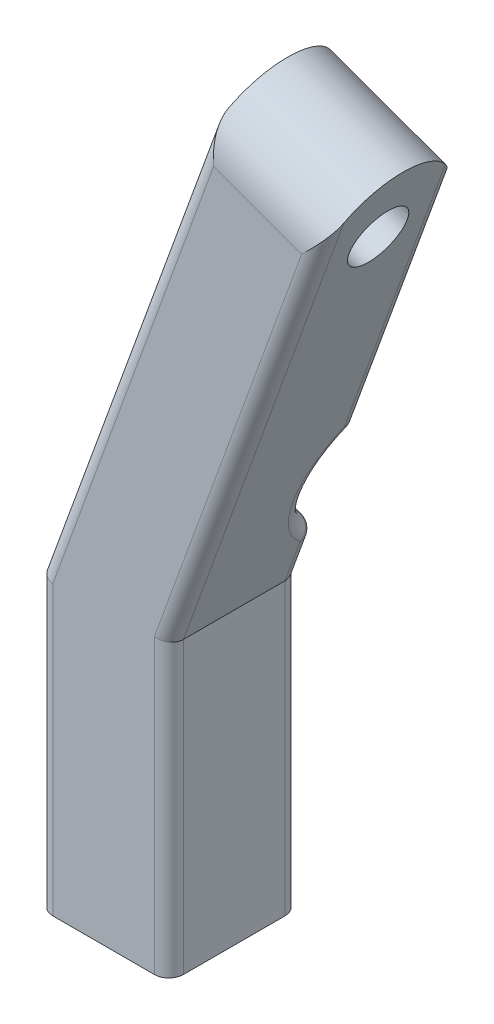
ISO-10303-21;
HEADER;
FILE_DESCRIPTION(('STEP AP214'),'2;1');
FILE_NAME('part.step','',(''),(''),'','','');
FILE_SCHEMA(('AUTOMOTIVE_DESIGN { 1 0 10303 214 1 1 1 1 }'));
ENDSEC;
DATA;
#1=APPLICATION_CONTEXT('core data for automotive mechanical design processes');
#2=APPLICATION_PROTOCOL_DEFINITION('international standard','automotive_design',2000,#1);
#3=PRODUCT_CONTEXT('',#1,'mechanical');
#4=PRODUCT('Part','Part','',(#3));
#5=PRODUCT_RELATED_PRODUCT_CATEGORY('part','',(#4));
#6=PRODUCT_DEFINITION_FORMATION('','',#4);
#7=PRODUCT_DEFINITION_CONTEXT('part definition',#1,'design');
#8=PRODUCT_DEFINITION('design','',#6,#7);
#9=PRODUCT_DEFINITION_SHAPE('','',#8);
#10=(LENGTH_UNIT() NAMED_UNIT(*) SI_UNIT(.MILLI.,.METRE.));
#11=(NAMED_UNIT(*) PLANE_ANGLE_UNIT() SI_UNIT($,.RADIAN.));
#12=(NAMED_UNIT(*) SI_UNIT($,.STERADIAN.) SOLID_ANGLE_UNIT());
#13=UNCERTAINTY_MEASURE_WITH_UNIT(LENGTH_MEASURE(1.E-05),#10,'distance_accuracy_value','');
#14=(GEOMETRIC_REPRESENTATION_CONTEXT(3) GLOBAL_UNCERTAINTY_ASSIGNED_CONTEXT((#13)) GLOBAL_UNIT_ASSIGNED_CONTEXT((#10,
#11,#12)) REPRESENTATION_CONTEXT('',''));
#15=CARTESIAN_POINT('',(0.,0.,0.));
#16=DIRECTION('',(0.,0.,1.));
#17=DIRECTION('',(1.,0.,0.));
#18=AXIS2_PLACEMENT_3D('',#15,#16,#17);
#19=CARTESIAN_POINT('',(20.6286848730728,51.9495491067209,9.));
#20=DIRECTION('',(-0.939692620785908,0.34202014332567,0.));
#21=DIRECTION('',(-0.34202014332567,-0.939692620785908,0.));
#22=AXIS2_PLACEMENT_3D('',#19,#20,#21);
#23=PLANE('',#22);
#24=CARTESIAN_POINT('',(18.9185841564444,47.2510860027914,4.5));
#25=DIRECTION('',(-0.939692620785908,0.34202014332567,0.));
#26=DIRECTION('',(-0.34202014332567,-0.939692620785908,0.));
#27=AXIS2_PLACEMENT_3D('',#24,#25,#26);
#28=CIRCLE('',#27,2.);
#29=CARTESIAN_POINT('',(18.2345438697931,45.3717007612196,4.5));
#30=VERTEX_POINT('',#29);
#31=EDGE_CURVE('E405',#30,#30,#28,.T.);
#32=ORIENTED_EDGE('',*,*,#31,.T.);
#33=EDGE_LOOP('',(#32));
#34=FACE_BOUND('',#33,.T.);
#35=DIRECTION('',(0.34202014332567,0.939692620785908,0.));
#36=VECTOR('',#35,1.);
#37=CARTESIAN_POINT('',(20.6286848730728,51.9495491067209,0.999999999999999));
#38=LINE('',#37,#36);
#39=CARTESIAN_POINT('',(13.0947116552434,31.2501278119588,0.999999999999998));
#40=VERTEX_POINT('',#39);
#41=CARTESIAN_POINT('',(20.0569732786992,50.378784410739,0.999999999999999));
#42=VERTEX_POINT('',#41);
#43=EDGE_CURVE('E198',#40,#42,#38,.T.);
#44=ORIENTED_EDGE('',*,*,#43,.T.);
#45=CARTESIAN_POINT('',(19.0895942281073,47.7209323131843,4.5));
#46=DIRECTION('',(0.939692620785908,-0.34202014332567,0.));
#47=DIRECTION('',(0.34202014332567,0.939692620785908,0.));
#48=AXIS2_PLACEMENT_3D('',#45,#46,#47);
#49=CIRCLE('',#48,4.5);
#50=CARTESIAN_POINT('',(20.0569732786992,50.378784410739,8.));
#51=VERTEX_POINT('',#50);
#52=EDGE_CURVE('E181',#42,#51,#49,.T.);
#53=ORIENTED_EDGE('',*,*,#52,.T.);
#54=DIRECTION('',(0.34202014332567,0.939692620785908,0.));
#55=VECTOR('',#54,1.);
#56=CARTESIAN_POINT('',(20.6286848730728,51.9495491067209,8.));
#57=LINE('',#56,#55);
#58=CARTESIAN_POINT('',(9.,20.,8.));
#59=VERTEX_POINT('',#58);
#60=EDGE_CURVE('E299',#51,#59,#57,.F.);
#61=ORIENTED_EDGE('',*,*,#60,.T.);
#62=DIRECTION('',(0.,0.,-1.));
#63=VECTOR('',#62,1.);
#64=CARTESIAN_POINT('',(9.,20.,9.));
#65=LINE('',#64,#63);
#66=CARTESIAN_POINT('',(9.,20.,0.999999999999999));
#67=VERTEX_POINT('',#66);
#68=EDGE_CURVE('E350',#59,#67,#65,.T.);
#69=ORIENTED_EDGE('',*,*,#68,.T.);
#70=DIRECTION('',(0.34202014332567,0.939692620785908,0.));
#71=VECTOR('',#70,1.);
#72=CARTESIAN_POINT('',(10.0355904946417,22.8452614998299,0.999999999999999));
#73=LINE('',#72,#71);
#74=CARTESIAN_POINT('',(10.0355904946417,22.8452614998299,0.999999999999999));
#75=VERTEX_POINT('',#74);
#76=EDGE_CURVE('E209',#67,#75,#73,.T.);
#77=ORIENTED_EDGE('',*,*,#76,.T.);
#78=CARTESIAN_POINT('',(11.5651510749425,27.0476946558943,-3.));
#79=DIRECTION('',(-0.939692620785908,0.34202014332567,0.));
#80=DIRECTION('',(-0.34202014332567,-0.939692620785908,0.));
#81=AXIS2_PLACEMENT_3D('',#78,#79,#80);
#82=CIRCLE('',#81,6.);
#83=EDGE_CURVE('E203',#75,#40,#82,.T.);
#84=ORIENTED_EDGE('',*,*,#83,.T.);
#85=EDGE_LOOP('',(#44,#53,#61,#69,#77,#84));
#86=FACE_BOUND('',#85,.T.);
#87=ADVANCED_FACE('F52',(#34,#86),#23,.F.);
#88=CARTESIAN_POINT('',(0.,20.,9.));
#89=DIRECTION('',(0.939692620785908,-0.342020143325669,0.));
#90=DIRECTION('',(0.342020143325669,0.939692620785908,0.));
#91=AXIS2_PLACEMENT_3D('',#88,#89,#90);
#92=PLANE('',#91);
#93=CARTESIAN_POINT('',(10.971384162409,50.1436302463808,4.5));
#94=DIRECTION('',(-0.939692620785908,0.342020143325669,0.));
#95=DIRECTION('',(-0.342020143325669,-0.939692620785908,0.));
#96=AXIS2_PLACEMENT_3D('',#93,#94,#95);
#97=CIRCLE('',#96,2.);
#98=CARTESIAN_POINT('',(10.2873438757577,48.264245004809,4.5));
#99=VERTEX_POINT('',#98);
#100=EDGE_CURVE('E408',#99,#99,#97,.T.);
#101=ORIENTED_EDGE('',*,*,#100,.F.);
#102=EDGE_LOOP('',(#101));
#103=FACE_BOUND('',#102,.T.);
#104=CARTESIAN_POINT('',(11.1423942340719,50.6134765567737,4.5));
#105=DIRECTION('',(0.939692620785908,-0.342020143325669,0.));
#106=DIRECTION('',(0.342020143325669,0.939692620785908,0.));
#107=AXIS2_PLACEMENT_3D('',#104,#105,#106);
#108=CIRCLE('',#107,4.5);
#109=CARTESIAN_POINT('',(12.1097732846638,53.2713286543284,1.00000000000001));
#110=VERTEX_POINT('',#109);
#111=CARTESIAN_POINT('',(12.1097732846638,53.2713286543284,8.));
#112=VERTEX_POINT('',#111);
#113=EDGE_CURVE('E72',#110,#112,#108,.T.);
#114=ORIENTED_EDGE('',*,*,#113,.F.);
#115=DIRECTION('',(-0.342020143325669,-0.939692620785908,0.));
#116=VECTOR('',#115,1.);
#117=CARTESIAN_POINT('',(5.14751166120796,34.1426720555482,0.999999999999999));
#118=LINE('',#117,#116);
#119=CARTESIAN_POINT('',(5.14751166120796,34.1426720555482,0.999999999999999));
#120=VERTEX_POINT('',#119);
#121=EDGE_CURVE('E231',#110,#120,#118,.T.);
#122=ORIENTED_EDGE('',*,*,#121,.T.);
#123=CARTESIAN_POINT('',(3.61795108090713,29.9402388994837,-3.));
#124=DIRECTION('',(0.939692620785908,-0.342020143325669,0.));
#125=DIRECTION('',(0.342020143325669,0.939692620785908,0.));
#126=AXIS2_PLACEMENT_3D('',#123,#124,#125);
#127=CIRCLE('',#126,6.);
#128=CARTESIAN_POINT('',(2.08839050060629,25.7378057434193,0.999999999999999));
#129=VERTEX_POINT('',#128);
#130=EDGE_CURVE('E229',#120,#129,#127,.T.);
#131=ORIENTED_EDGE('',*,*,#130,.T.);
#132=DIRECTION('',(-0.342020143325669,-0.939692620785908,0.));
#133=VECTOR('',#132,1.);
#134=CARTESIAN_POINT('',(0.,20.,0.999999999999999));
#135=LINE('',#134,#133);
#136=CARTESIAN_POINT('',(0.,20.,0.999999999999999));
#137=VERTEX_POINT('',#136);
#138=EDGE_CURVE('E226',#129,#137,#135,.T.);
#139=ORIENTED_EDGE('',*,*,#138,.T.);
#140=DIRECTION('',(0.,0.,-1.));
#141=VECTOR('',#140,1.);
#142=CARTESIAN_POINT('',(0.,20.,9.));
#143=LINE('',#142,#141);
#144=CARTESIAN_POINT('',(0.,20.,8.));
#145=VERTEX_POINT('',#144);
#146=EDGE_CURVE('E348',#145,#137,#143,.T.);
#147=ORIENTED_EDGE('',*,*,#146,.F.);
#148=DIRECTION('',(-0.342020143325669,-0.939692620785908,0.));
#149=VECTOR('',#148,1.);
#150=CARTESIAN_POINT('',(0.,20.,8.));
#151=LINE('',#150,#149);
#152=EDGE_CURVE('E301',#145,#112,#151,.F.);
#153=ORIENTED_EDGE('',*,*,#152,.T.);
#154=EDGE_LOOP('',(#114,#122,#131,#139,#147,#153));
#155=FACE_BOUND('',#154,.T.);
#156=ADVANCED_FACE('F453',(#103,#155),#92,.F.);
#157=CARTESIAN_POINT('',(0.,0.,0.));
#158=DIRECTION('',(0.,0.,-1.));
#159=DIRECTION('',(-1.,0.,0.));
#160=AXIS2_PLACEMENT_3D('',#157,#158,#159);
#161=PLANE('',#160);
#162=DIRECTION('',(-0.342020143325669,-0.939692620785908,0.));
#163=VECTOR('',#162,1.);
#164=CARTESIAN_POINT('',(13.6211774998233,54.5000732069846,0.));
#165=LINE('',#164,#163);
#166=CARTESIAN_POINT('',(6.08720428199387,33.8006519122225,0.));
#167=VERTEX_POINT('',#166);
#168=CARTESIAN_POINT('',(12.0820868548578,50.2714564134481,0.));
#169=VERTEX_POINT('',#168);
#170=EDGE_CURVE('E205',#167,#169,#165,.F.);
#171=ORIENTED_EDGE('',*,*,#170,.T.);
#172=DIRECTION('',(0.939692620785908,-0.342020143325669,0.));
#173=VECTOR('',#172,1.);
#174=CARTESIAN_POINT('',(4.99420491631864,52.8512344630694,0.));
#175=LINE('',#174,#173);
#176=CARTESIAN_POINT('',(18.1499016073213,48.06295245651,0.));
#177=VERTEX_POINT('',#176);
#178=EDGE_CURVE('E200',#169,#177,#175,.T.);
#179=ORIENTED_EDGE('',*,*,#178,.T.);
#180=DIRECTION('',(0.34202014332567,0.939692620785908,0.));
#181=VECTOR('',#180,1.);
#182=CARTESIAN_POINT('',(12.1550190344574,31.5921479552844,0.));
#183=LINE('',#182,#181);
#184=CARTESIAN_POINT('',(12.1550190344574,31.5921479552844,0.));
#185=VERTEX_POINT('',#184);
#186=EDGE_CURVE('E199',#177,#185,#183,.F.);
#187=ORIENTED_EDGE('',*,*,#186,.T.);
#188=DIRECTION('',(-0.939692620785908,0.34202014332567,0.));
#189=VECTOR('',#188,1.);
#190=CARTESIAN_POINT('',(5.14751166120796,34.1426720555482,0.));
#191=LINE('',#190,#189);
#192=EDGE_CURVE('E360',#185,#167,#191,.T.);
#193=ORIENTED_EDGE('',*,*,#192,.T.);
#194=EDGE_LOOP('',(#171,#179,#187,#193));
#195=FACE_BOUND('',#194,.T.);
#196=ADVANCED_FACE('F401',(#195),#161,.T.);
#197=CARTESIAN_POINT('',(19.6889922522869,52.2915692500465,0.999999999999999));
#198=DIRECTION('',(-0.34202014332567,-0.939692620785908,0.));
#199=DIRECTION('',(0.939692620785908,-0.34202014332567,0.));
#200=AXIS2_PLACEMENT_3D('',#197,#198,#199);
#201=CYLINDRICAL_SURFACE('',#200,1.);
#202=ORIENTED_EDGE('',*,*,#186,.F.);
#203=CARTESIAN_POINT('',(20.0569732786992,50.378784410739,0.999999999999999));
#204=CARTESIAN_POINT('',(20.0377970741125,50.32618437219,0.954743050678537));
#205=CARTESIAN_POINT('',(20.0154365664339,50.2736362015838,0.910891854609985));
#206=CARTESIAN_POINT('',(19.9653490970672,50.1687947661599,0.826265396472308));
#207=CARTESIAN_POINT('',(19.9376324731201,50.1165012061112,0.785484416013811));
#208=CARTESIAN_POINT('',(19.8779757189125,50.0125046705521,0.707378307157541));
#209=CARTESIAN_POINT('',(19.846068336757,49.9608001873787,0.670029853152155));
#210=CARTESIAN_POINT('',(19.778573462846,49.8575732697211,0.598473695250581));
#211=CARTESIAN_POINT('',(19.7429835574295,49.8060509778213,0.564268079367654));
#212=CARTESIAN_POINT('',(19.6465207030886,49.6724173046542,0.47948509305024));
#213=CARTESIAN_POINT('',(19.5832662995524,49.5904574563704,0.431364682635846));
#214=CARTESIAN_POINT('',(19.4509043475848,49.4270032411482,0.343059167372879));
#215=CARTESIAN_POINT('',(19.3817945240321,49.3455090683974,0.302877167381819));
#216=CARTESIAN_POINT('',(19.2388918225492,49.182559802029,0.230075919585969));
#217=CARTESIAN_POINT('',(19.1650795437087,49.1011064829517,0.197490985232561));
#218=CARTESIAN_POINT('',(19.0142604341818,48.9385477876584,0.139907686295118));
#219=CARTESIAN_POINT('',(18.9372544102338,48.8574423292162,0.114907418936207));
#220=CARTESIAN_POINT('',(18.7454791596056,48.6586448978245,0.0626068902517143));
#221=CARTESIAN_POINT('',(18.6294504498066,48.5410745716634,0.0394235265738951));
#222=CARTESIAN_POINT('',(18.3954082443713,48.3064478384064,0.00834927003408367));
#223=CARTESIAN_POINT('',(18.2774002358308,48.1893908762609,0.000421478913732489));
#224=CARTESIAN_POINT('',(18.1562524923779,48.069250491002,5.45908272960541E-06));
#225=CARTESIAN_POINT('',(18.1530770255399,48.0661014504406,4.96199333660962E-09));
#226=CARTESIAN_POINT('',(18.1499016073214,48.06295245651,0.));
#227=B_SPLINE_CURVE_WITH_KNOTS('',3,(#203,#204,#205,#206,#207,#208,#209,#210,#211,#212,#213,
#214,#215,#216,#217,#218,#219,#220,#221,#222,#223,#224,#225,#226),.UNSPECIFIED.,.F.,.F.,(4,2,2,
2,2,2,2,2,2,2,2,4),(0.,0.21578260692177,0.431152822075277,0.644930394770631,0.858848983544129,
1.20082332099114,1.54293114720841,1.88655545684144,2.23009348959458,2.72973479565721,
3.22816610576646,3.24158252361179),.UNSPECIFIED.);
#228=EDGE_CURVE('E184',#177,#42,#227,.F.);
#229=ORIENTED_EDGE('',*,*,#228,.T.);
#230=ORIENTED_EDGE('',*,*,#43,.F.);
#231=CARTESIAN_POINT('',(12.1550190344574,31.5921479552844,1.));
#232=DIRECTION('',(0.342020143325669,0.939692620785908,0.));
#233=DIRECTION('',(-0.939692620785908,0.342020143325669,0.));
#234=AXIS2_PLACEMENT_3D('',#231,#232,#233);
#235=CIRCLE('',#234,1.);
#236=EDGE_CURVE('E253',#40,#185,#235,.T.);
#237=ORIENTED_EDGE('',*,*,#236,.T.);
#238=EDGE_LOOP('',(#202,#229,#230,#237));
#239=FACE_BOUND('',#238,.T.);
#240=ADVANCED_FACE('F196',(#239),#201,.T.);
#241=CARTESIAN_POINT('',(0.939692620785908,19.6579798566743,0.999999999999999));
#242=DIRECTION('',(0.342020143325669,0.939692620785908,0.));
#243=DIRECTION('',(-0.939692620785908,0.342020143325669,0.));
#244=AXIS2_PLACEMENT_3D('',#241,#242,#243);
#245=CYLINDRICAL_SURFACE('',#244,1.);
#246=ORIENTED_EDGE('',*,*,#121,.F.);
#247=CARTESIAN_POINT('',(12.1097732846638,53.2713286543284,0.999999999999999));
#248=CARTESIAN_POINT('',(12.0906524565791,53.2187084603811,0.954743050678539));
#249=CARTESIAN_POINT('',(12.0740042862543,53.16408116901,0.910891854609987));
#250=CARTESIAN_POINT('',(12.0449827381603,53.0515723652854,0.826265396472307));
#251=CARTESIAN_POINT('',(12.0326012514513,52.9936972717436,0.785484416013808));
#252=CARTESIAN_POINT('',(12.0114532919988,52.8756846811362,0.707378307157534));
#253=CARTESIAN_POINT('',(12.0026607636444,52.8155670792098,0.670029853152145));
#254=CARTESIAN_POINT('',(11.9880118530865,52.6931058038906,0.598473695250572));
#255=CARTESIAN_POINT('',(11.9821574115061,52.6307606882523,0.564268079367646));
#256=CARTESIAN_POINT('',(11.9701541756926,52.4663862279438,0.479485093050236));
#257=CARTESIAN_POINT('',(11.9659270850557,52.3629421947559,0.431364682635844));
#258=CARTESIAN_POINT('',(11.962255878545,52.1526483787618,0.343059167372876));
#259=CARTESIAN_POINT('',(11.9628136303366,52.0457972822922,0.302877167381816));
#260=CARTESIAN_POINT('',(11.9675416812852,51.8291148163765,0.230075919585965));
#261=CARTESIAN_POINT('',(11.9717279830542,51.7192723356422,0.197490985232557));
#262=CARTESIAN_POINT('',(11.9827714086421,51.4978004955243,0.139907686295114));
#263=CARTESIAN_POINT('',(11.9896278616095,51.3861715917131,0.114907418936201));
#264=CARTESIAN_POINT('',(12.0087517009449,51.1106131691408,0.0626068902517084));
#265=CARTESIAN_POINT('',(12.0220621004056,50.9459672570827,0.0394235265738895));
#266=CARTESIAN_POINT('',(12.0505336742956,50.6157933220665,0.00834927003408669));
#267=CARTESIAN_POINT('',(12.0656902885867,50.4502684009529,0.00042147891374459));
#268=CARTESIAN_POINT('',(12.0812700931881,50.2803632579982,5.45908272922342E-06));
#269=CARTESIAN_POINT('',(12.0816784776584,50.2759098022365,4.9619926119972E-09));
#270=CARTESIAN_POINT('',(12.0820868548578,50.2714564134481,0.));
#271=B_SPLINE_CURVE_WITH_KNOTS('',3,(#247,#248,#249,#250,#251,#252,#253,#254,#255,#256,#257,
#258,#259,#260,#261,#262,#263,#264,#265,#266,#267,#268,#269,#270),.UNSPECIFIED.,.F.,.F.,(4,2,2,
2,2,2,2,2,2,2,2,4),(0.,0.215782606921779,0.431152822075298,0.64493039477066,0.858848983544151,
1.20082332099115,1.54293114720842,1.88655545684146,2.23009348959463,2.72973479565723,
3.22816610576647,3.24158252361181),.UNSPECIFIED.);
#272=EDGE_CURVE('E12',#110,#169,#271,.T.);
#273=ORIENTED_EDGE('',*,*,#272,.T.);
#274=ORIENTED_EDGE('',*,*,#170,.F.);
#275=CARTESIAN_POINT('',(6.08720428199387,33.8006519122225,1.));
#276=DIRECTION('',(0.34202014332567,0.939692620785908,0.));
#277=DIRECTION('',(-0.939692620785908,0.34202014332567,0.));
#278=AXIS2_PLACEMENT_3D('',#275,#276,#277);
#279=CIRCLE('',#278,1.);
#280=EDGE_CURVE('E269',#167,#120,#279,.T.);
#281=ORIENTED_EDGE('',*,*,#280,.T.);
#282=EDGE_LOOP('',(#246,#273,#274,#281));
#283=FACE_BOUND('',#282,.T.);
#284=ADVANCED_FACE('F404',(#283),#245,.T.);
#285=CARTESIAN_POINT('',(0.,0.,9.));
#286=DIRECTION('',(0.,0.,-1.));
#287=DIRECTION('',(-1.,0.,0.));
#288=AXIS2_PLACEMENT_3D('',#285,#286,#287);
#289=PLANE('',#288);
#290=DIRECTION('',(0.939692620785908,-0.342020143325669,0.));
#291=VECTOR('',#290,1.);
#292=CARTESIAN_POINT('',(4.99420491631863,52.8512344630694,9.));
#293=LINE('',#292,#291);
#294=CARTESIAN_POINT('',(12.0820868548578,50.2714564134481,9.00000000000001));
#295=VERTEX_POINT('',#294);
#296=CARTESIAN_POINT('',(18.1499016073214,48.06295245651,9.00000000000001));
#297=VERTEX_POINT('',#296);
#298=EDGE_CURVE('E191',#295,#297,#293,.T.);
#299=ORIENTED_EDGE('',*,*,#298,.F.);
#300=DIRECTION('',(-0.342020143325669,-0.939692620785908,0.));
#301=VECTOR('',#300,1.);
#302=CARTESIAN_POINT('',(-5.4881834760795,1.99753542548456,9.));
#303=LINE('',#302,#301);
#304=CARTESIAN_POINT('',(1.,19.8236730192915,9.));
#305=VERTEX_POINT('',#304);
#306=EDGE_CURVE('E285',#295,#305,#303,.T.);
#307=ORIENTED_EDGE('',*,*,#306,.T.);
#308=DIRECTION('',(0.,-1.,0.));
#309=VECTOR('',#308,1.);
#310=CARTESIAN_POINT('',(1.,0.,9.));
#311=LINE('',#310,#309);
#312=CARTESIAN_POINT('',(0.999999999999999,0.,9.));
#313=VERTEX_POINT('',#312);
#314=EDGE_CURVE('E252',#305,#313,#311,.T.);
#315=ORIENTED_EDGE('',*,*,#314,.T.);
#316=DIRECTION('',(1.,0.,0.));
#317=VECTOR('',#316,1.);
#318=CARTESIAN_POINT('',(9.,0.,9.));
#319=LINE('',#318,#317);
#320=CARTESIAN_POINT('',(8.,0.,9.));
#321=VERTEX_POINT('',#320);
#322=EDGE_CURVE('E341',#313,#321,#319,.T.);
#323=ORIENTED_EDGE('',*,*,#322,.T.);
#324=DIRECTION('',(0.,1.,0.));
#325=VECTOR('',#324,1.);
#326=CARTESIAN_POINT('',(8.,0.,9.));
#327=LINE('',#326,#325);
#328=CARTESIAN_POINT('',(8.,20.1763269807085,9.));
#329=VERTEX_POINT('',#328);
#330=EDGE_CURVE('E290',#321,#329,#327,.T.);
#331=ORIENTED_EDGE('',*,*,#330,.T.);
#332=DIRECTION('',(0.34202014332567,0.939692620785908,0.));
#333=VECTOR('',#332,1.);
#334=CARTESIAN_POINT('',(0.579631276384077,-0.210968531453531,9.));
#335=LINE('',#334,#333);
#336=EDGE_CURVE('E287',#329,#297,#335,.T.);
#337=ORIENTED_EDGE('',*,*,#336,.T.);
#338=EDGE_LOOP('',(#299,#307,#315,#323,#331,#337));
#339=FACE_BOUND('',#338,.T.);
#340=ADVANCED_FACE('F324',(#339),#289,.F.);
#341=CARTESIAN_POINT('',(0.579631276384081,-0.210968531453532,8.));
#342=DIRECTION('',(0.34202014332567,0.939692620785908,0.));
#343=DIRECTION('',(-0.939692620785908,0.34202014332567,0.));
#344=AXIS2_PLACEMENT_3D('',#341,#342,#343);
#345=CYLINDRICAL_SURFACE('',#344,1.);
#346=ORIENTED_EDGE('',*,*,#60,.F.);
#347=CARTESIAN_POINT('',(20.0569732786992,50.378784410739,8.));
#348=CARTESIAN_POINT('',(20.0377970741125,50.32618437219,8.04525694932147));
#349=CARTESIAN_POINT('',(20.0154365664339,50.2736362015838,8.08910814539003));
#350=CARTESIAN_POINT('',(19.9653490970672,50.1687947661599,8.17373460352773));
#351=CARTESIAN_POINT('',(19.93763247312,50.1165012061111,8.21451558398623));
#352=CARTESIAN_POINT('',(19.8779757189125,50.012504670552,8.2926216928425));
#353=CARTESIAN_POINT('',(19.846068336757,49.9608001873787,8.32997014684788));
#354=CARTESIAN_POINT('',(19.778573462846,49.8575732697211,8.40152630474944));
#355=CARTESIAN_POINT('',(19.7429835574295,49.8060509778213,8.43573192063235));
#356=CARTESIAN_POINT('',(19.6465207030887,49.6724173046542,8.52051490694975));
#357=CARTESIAN_POINT('',(19.5832662995524,49.5904574563704,8.56863531736414));
#358=CARTESIAN_POINT('',(19.4509043475849,49.4270032411482,8.6569408326271));
#359=CARTESIAN_POINT('',(19.3817945240321,49.3455090683974,8.69712283261816));
#360=CARTESIAN_POINT('',(19.2388918225493,49.1825598020291,8.76992408041401));
#361=CARTESIAN_POINT('',(19.1650795437087,49.1011064829517,8.80250901476742));
#362=CARTESIAN_POINT('',(19.0142604341818,48.9385477876584,8.86009231370487));
#363=CARTESIAN_POINT('',(18.9372544102339,48.8574423292161,8.88509258106378));
#364=CARTESIAN_POINT('',(18.7454791596055,48.6586448978246,8.93739310974829));
#365=CARTESIAN_POINT('',(18.6294504498062,48.5410745716638,8.96057647342611));
#366=CARTESIAN_POINT('',(18.3954082443717,48.3064478384059,8.99165072996591));
#367=CARTESIAN_POINT('',(18.2774002358325,48.1893908762592,8.99957852108625));
#368=CARTESIAN_POINT('',(18.156252492378,48.0692504910018,8.99999454091727));
#369=CARTESIAN_POINT('',(18.1530770255399,48.0661014504405,8.99999999503801));
#370=CARTESIAN_POINT('',(18.1499016073213,48.0629524565099,9.));
#371=B_SPLINE_CURVE_WITH_KNOTS('',3,(#347,#348,#349,#350,#351,#352,#353,#354,#355,#356,#357,
#358,#359,#360,#361,#362,#363,#364,#365,#366,#367,#368,#369,#370),.UNSPECIFIED.,.F.,.F.,(4,2,2,
2,2,2,2,2,2,2,2,4),(0.,0.21578260692182,0.431152822075384,0.644930394770693,0.85884898354414,
1.20082332099111,1.54293114720833,1.8865554568414,2.23009348959458,2.72973479565725,
3.22816610576653,3.24158252361186),.UNSPECIFIED.);
#372=EDGE_CURVE('E187',#51,#297,#371,.T.);
#373=ORIENTED_EDGE('',*,*,#372,.T.);
#374=ORIENTED_EDGE('',*,*,#336,.F.);
#375=CARTESIAN_POINT('',(8.,20.1763269807085,8.));
#376=DIRECTION('',(0.173648177666931,0.984807753012208,0.));
#377=DIRECTION('',(-0.984807753012208,0.17364817766693,0.));
#378=AXIS2_PLACEMENT_3D('',#375,#376,#377);
#379=ELLIPSE('',#378,1.01542661188575,1.);
#380=EDGE_CURVE('E273',#59,#329,#379,.F.);
#381=ORIENTED_EDGE('',*,*,#380,.F.);
#382=EDGE_LOOP('',(#346,#373,#374,#381));
#383=FACE_BOUND('',#382,.T.);
#384=ADVANCED_FACE('F319',(#383),#345,.T.);
#385=CARTESIAN_POINT('',(-5.4881834760795,1.99753542548456,8.));
#386=DIRECTION('',(-0.342020143325669,-0.939692620785908,0.));
#387=DIRECTION('',(0.939692620785908,-0.342020143325669,0.));
#388=AXIS2_PLACEMENT_3D('',#385,#386,#387);
#389=CYLINDRICAL_SURFACE('',#388,1.);
#390=ORIENTED_EDGE('',*,*,#306,.F.);
#391=CARTESIAN_POINT('',(12.1097732846638,53.2713286543285,8.));
#392=CARTESIAN_POINT('',(12.0906524565791,53.218708460381,8.04525694932147));
#393=CARTESIAN_POINT('',(12.0740042862543,53.16408116901,8.08910814539003));
#394=CARTESIAN_POINT('',(12.0449827381603,53.0515723652854,8.17373460352773));
#395=CARTESIAN_POINT('',(12.0326012514513,52.9936972717435,8.21451558398624));
#396=CARTESIAN_POINT('',(12.0114532919988,52.8756846811361,8.29262169284251));
#397=CARTESIAN_POINT('',(12.0026607636444,52.8155670792097,8.32997014684789));
#398=CARTESIAN_POINT('',(11.9880118530865,52.6931058038905,8.40152630474944));
#399=CARTESIAN_POINT('',(11.9821574115061,52.6307606882523,8.43573192063236));
#400=CARTESIAN_POINT('',(11.9701541756926,52.4663862279438,8.52051490694976));
#401=CARTESIAN_POINT('',(11.9659270850557,52.3629421947559,8.56863531736414));
#402=CARTESIAN_POINT('',(11.962255878545,52.1526483787619,8.6569408326271));
#403=CARTESIAN_POINT('',(11.9628136303366,52.0457972822923,8.69712283261816));
#404=CARTESIAN_POINT('',(11.9675416812852,51.8291148163765,8.76992408041402));
#405=CARTESIAN_POINT('',(11.9717279830542,51.7192723356423,8.80250901476743));
#406=CARTESIAN_POINT('',(11.982771408642,51.4978004955243,8.86009231370488));
#407=CARTESIAN_POINT('',(11.9896278616094,51.3861715917131,8.88509258106379));
#408=CARTESIAN_POINT('',(12.0087517009451,51.1106131691408,8.93739310974829));
#409=CARTESIAN_POINT('',(12.0220621004063,50.9459672570827,8.96057647342611));
#410=CARTESIAN_POINT('',(12.050533674295,50.6157933220664,8.99165072996591));
#411=CARTESIAN_POINT('',(12.0656902885842,50.4502684009527,8.99957852108625));
#412=CARTESIAN_POINT('',(12.081270093188,50.2803632579982,8.99999454091727));
#413=CARTESIAN_POINT('',(12.0816784776584,50.2759098022365,8.99999999503801));
#414=CARTESIAN_POINT('',(12.0820868548578,50.2714564134481,9.));
#415=B_SPLINE_CURVE_WITH_KNOTS('',3,(#391,#392,#393,#394,#395,#396,#397,#398,#399,#400,#401,
#402,#403,#404,#405,#406,#407,#408,#409,#410,#411,#412,#413,#414),.UNSPECIFIED.,.F.,.F.,(4,2,2,
2,2,2,2,2,2,2,2,4),(0.,0.215782606921835,0.431152822075412,0.644930394770713,0.858848983544156,
1.20082332099112,1.54293114720835,1.88655545684143,2.23009348959463,2.72973479565722,
3.22816610576644,3.24158252361179),.UNSPECIFIED.);
#416=EDGE_CURVE('E65',#295,#112,#415,.F.);
#417=ORIENTED_EDGE('',*,*,#416,.T.);
#418=ORIENTED_EDGE('',*,*,#152,.F.);
#419=CARTESIAN_POINT('',(0.999999999999999,19.8236730192915,8.));
#420=DIRECTION('',(-0.173648177666931,-0.984807753012208,0.));
#421=DIRECTION('',(0.984807753012208,-0.173648177666931,0.));
#422=AXIS2_PLACEMENT_3D('',#419,#420,#421);
#423=ELLIPSE('',#422,1.01542661188575,1.);
#424=EDGE_CURVE('E306',#145,#305,#423,.F.);
#425=ORIENTED_EDGE('',*,*,#424,.T.);
#426=EDGE_LOOP('',(#390,#417,#418,#425));
#427=FACE_BOUND('',#426,.T.);
#428=ADVANCED_FACE('F314',(#427),#389,.T.);
#429=CARTESIAN_POINT('',(9.,0.,9.));
#430=DIRECTION('',(0.,1.,0.));
#431=DIRECTION('',(-1.,0.,0.));
#432=AXIS2_PLACEMENT_3D('',#429,#430,#431);
#433=PLANE('',#432);
#434=CARTESIAN_POINT('',(4.5,0.,4.5));
#435=DIRECTION('',(0.,-1.,0.));
#436=DIRECTION('',(1.,0.,0.));
#437=AXIS2_PLACEMENT_3D('',#434,#435,#436);
#438=CIRCLE('',#437,2.5);
#439=CARTESIAN_POINT('',(7.,0.,4.5));
#440=VERTEX_POINT('',#439);
#441=EDGE_CURVE('E268',#440,#440,#438,.T.);
#442=ORIENTED_EDGE('',*,*,#441,.F.);
#443=EDGE_LOOP('',(#442));
#444=FACE_BOUND('',#443,.T.);
#445=DIRECTION('',(0.,0.,-1.));
#446=VECTOR('',#445,1.);
#447=CARTESIAN_POINT('',(9.,0.,9.));
#448=LINE('',#447,#446);
#449=CARTESIAN_POINT('',(9.,0.,8.));
#450=VERTEX_POINT('',#449);
#451=CARTESIAN_POINT('',(9.,0.,0.999999999999999));
#452=VERTEX_POINT('',#451);
#453=EDGE_CURVE('E352',#450,#452,#448,.T.);
#454=ORIENTED_EDGE('',*,*,#453,.F.);
#455=CARTESIAN_POINT('',(8.,0.,8.));
#456=DIRECTION('',(0.,1.,0.));
#457=DIRECTION('',(-1.,0.,0.));
#458=AXIS2_PLACEMENT_3D('',#455,#456,#457);
#459=CIRCLE('',#458,1.);
#460=EDGE_CURVE('E297',#450,#321,#459,.F.);
#461=ORIENTED_EDGE('',*,*,#460,.T.);
#462=ORIENTED_EDGE('',*,*,#322,.F.);
#463=CARTESIAN_POINT('',(1.,0.,8.));
#464=DIRECTION('',(0.,1.,0.));
#465=DIRECTION('',(-1.,0.,0.));
#466=AXIS2_PLACEMENT_3D('',#463,#464,#465);
#467=CIRCLE('',#466,1.);
#468=CARTESIAN_POINT('',(0.,0.,8.));
#469=VERTEX_POINT('',#468);
#470=EDGE_CURVE('E295',#313,#469,#467,.F.);
#471=ORIENTED_EDGE('',*,*,#470,.T.);
#472=DIRECTION('',(0.,0.,-1.));
#473=VECTOR('',#472,1.);
#474=CARTESIAN_POINT('',(0.,0.,9.));
#475=LINE('',#474,#473);
#476=CARTESIAN_POINT('',(0.,0.,0.999999999999999));
#477=VERTEX_POINT('',#476);
#478=EDGE_CURVE('E344',#469,#477,#475,.T.);
#479=ORIENTED_EDGE('',*,*,#478,.T.);
#480=CARTESIAN_POINT('',(1.,0.,0.999999999999999));
#481=DIRECTION('',(0.,1.,0.));
#482=DIRECTION('',(-1.,0.,0.));
#483=AXIS2_PLACEMENT_3D('',#480,#481,#482);
#484=CIRCLE('',#483,1.);
#485=CARTESIAN_POINT('',(0.999999999999999,0.,0.));
#486=VERTEX_POINT('',#485);
#487=EDGE_CURVE('E244',#477,#486,#484,.F.);
#488=ORIENTED_EDGE('',*,*,#487,.T.);
#489=DIRECTION('',(1.,0.,0.));
#490=VECTOR('',#489,1.);
#491=CARTESIAN_POINT('',(9.,0.,0.));
#492=LINE('',#491,#490);
#493=CARTESIAN_POINT('',(8.,0.,0.));
#494=VERTEX_POINT('',#493);
#495=EDGE_CURVE('E338',#486,#494,#492,.T.);
#496=ORIENTED_EDGE('',*,*,#495,.T.);
#497=CARTESIAN_POINT('',(8.,0.,0.999999999999999));
#498=DIRECTION('',(0.,1.,0.));
#499=DIRECTION('',(-1.,0.,0.));
#500=AXIS2_PLACEMENT_3D('',#497,#498,#499);
#501=CIRCLE('',#500,1.);
#502=EDGE_CURVE('E246',#494,#452,#501,.F.);
#503=ORIENTED_EDGE('',*,*,#502,.T.);
#504=EDGE_LOOP('',(#454,#461,#462,#471,#479,#488,#496,#503));
#505=FACE_BOUND('',#504,.T.);
#506=ADVANCED_FACE('F318',(#444,#505),#433,.F.);
#507=CARTESIAN_POINT('',(9.,20.,9.));
#508=DIRECTION('',(-1.,0.,0.));
#509=DIRECTION('',(0.,-1.,0.));
#510=AXIS2_PLACEMENT_3D('',#507,#508,#509);
#511=PLANE('',#510);
#512=ORIENTED_EDGE('',*,*,#68,.F.);
#513=DIRECTION('',(0.,1.,0.));
#514=VECTOR('',#513,1.);
#515=CARTESIAN_POINT('',(9.,20.,8.));
#516=LINE('',#515,#514);
#517=EDGE_CURVE('E293',#59,#450,#516,.F.);
#518=ORIENTED_EDGE('',*,*,#517,.T.);
#519=ORIENTED_EDGE('',*,*,#453,.T.);
#520=DIRECTION('',(0.,1.,0.));
#521=VECTOR('',#520,1.);
#522=CARTESIAN_POINT('',(9.,20.,0.999999999999999));
#523=LINE('',#522,#521);
#524=EDGE_CURVE('E241',#452,#67,#523,.T.);
#525=ORIENTED_EDGE('',*,*,#524,.T.);
#526=EDGE_LOOP('',(#512,#518,#519,#525));
#527=FACE_BOUND('',#526,.T.);
#528=ADVANCED_FACE('F463',(#527),#511,.F.);
#529=CARTESIAN_POINT('',(0.,0.,9.));
#530=DIRECTION('',(1.,0.,0.));
#531=DIRECTION('',(0.,0.,-1.));
#532=AXIS2_PLACEMENT_3D('',#529,#530,#531);
#533=PLANE('',#532);
#534=ORIENTED_EDGE('',*,*,#478,.F.);
#535=DIRECTION('',(0.,-1.,0.));
#536=VECTOR('',#535,1.);
#537=CARTESIAN_POINT('',(0.,0.,8.));
#538=LINE('',#537,#536);
#539=EDGE_CURVE('E80',#469,#145,#538,.F.);
#540=ORIENTED_EDGE('',*,*,#539,.T.);
#541=ORIENTED_EDGE('',*,*,#146,.T.);
#542=DIRECTION('',(0.,-1.,0.));
#543=VECTOR('',#542,1.);
#544=CARTESIAN_POINT('',(0.,0.,0.999999999999999));
#545=LINE('',#544,#543);
#546=EDGE_CURVE('E249',#137,#477,#545,.T.);
#547=ORIENTED_EDGE('',*,*,#546,.T.);
#548=EDGE_LOOP('',(#534,#540,#541,#547));
#549=FACE_BOUND('',#548,.T.);
#550=ADVANCED_FACE('F466',(#549),#533,.F.);
#551=DIRECTION('',(-0.939692620785908,0.34202014332567,0.));
#552=VECTOR('',#551,1.);
#553=CARTESIAN_POINT('',(10.0355904946417,22.8452614998299,0.));
#554=LINE('',#553,#552);
#555=CARTESIAN_POINT('',(3.0280831213922,25.3957856000936,0.));
#556=VERTEX_POINT('',#555);
#557=CARTESIAN_POINT('',(9.09589787385578,23.1872816431555,0.));
#558=VERTEX_POINT('',#557);
#559=EDGE_CURVE('E363',#556,#558,#554,.F.);
#560=ORIENTED_EDGE('',*,*,#559,.T.);
#561=DIRECTION('',(0.34202014332567,0.939692620785908,0.));
#562=VECTOR('',#561,1.);
#563=CARTESIAN_POINT('',(8.06030737921409,20.3420201433257,0.));
#564=LINE('',#563,#562);
#565=CARTESIAN_POINT('',(8.,20.1763269807085,0.));
#566=VERTEX_POINT('',#565);
#567=EDGE_CURVE('E239',#558,#566,#564,.F.);
#568=ORIENTED_EDGE('',*,*,#567,.T.);
#569=DIRECTION('',(0.,1.,0.));
#570=VECTOR('',#569,1.);
#571=CARTESIAN_POINT('',(8.,0.,0.));
#572=LINE('',#571,#570);
#573=EDGE_CURVE('E237',#566,#494,#572,.F.);
#574=ORIENTED_EDGE('',*,*,#573,.T.);
#575=ORIENTED_EDGE('',*,*,#495,.F.);
#576=DIRECTION('',(0.,-1.,0.));
#577=VECTOR('',#576,1.);
#578=CARTESIAN_POINT('',(1.,20.,0.));
#579=LINE('',#578,#577);
#580=CARTESIAN_POINT('',(1.,19.8236730192915,0.));
#581=VERTEX_POINT('',#580);
#582=EDGE_CURVE('E233',#486,#581,#579,.F.);
#583=ORIENTED_EDGE('',*,*,#582,.T.);
#584=DIRECTION('',(-0.342020143325669,-0.939692620785908,0.));
#585=VECTOR('',#584,1.);
#586=CARTESIAN_POINT('',(3.0280831213922,25.3957856000936,0.));
#587=LINE('',#586,#585);
#588=EDGE_CURVE('E235',#581,#556,#587,.F.);
#589=ORIENTED_EDGE('',*,*,#588,.T.);
#590=EDGE_LOOP('',(#560,#568,#574,#575,#583,#589));
#591=FACE_BOUND('',#590,.T.);
#592=ADVANCED_FACE('F486',(#591),#161,.T.);
#593=CARTESIAN_POINT('',(4.5,15.,4.5));
#594=DIRECTION('',(0.,-1.,0.));
#595=DIRECTION('',(1.,0.,0.));
#596=AXIS2_PLACEMENT_3D('',#593,#594,#595);
#597=CYLINDRICAL_SURFACE('',#596,2.5);
#598=CARTESIAN_POINT('',(4.5,15.,4.5));
#599=DIRECTION('',(0.,-1.,0.));
#600=DIRECTION('',(1.,0.,0.));
#601=AXIS2_PLACEMENT_3D('',#598,#599,#600);
#602=CIRCLE('',#601,2.5);
#603=CARTESIAN_POINT('',(7.,15.,4.5));
#604=VERTEX_POINT('',#603);
#605=EDGE_CURVE('E335',#604,#604,#602,.T.);
#606=ORIENTED_EDGE('',*,*,#605,.F.);
#607=EDGE_LOOP('',(#606));
#608=FACE_BOUND('',#607,.T.);
#609=ORIENTED_EDGE('',*,*,#441,.T.);
#610=EDGE_LOOP('',(#609));
#611=FACE_BOUND('',#610,.T.);
#612=ADVANCED_FACE('F480',(#608,#611),#597,.F.);
#613=CARTESIAN_POINT('',(4.5,15.,4.5));
#614=DIRECTION('',(0.,-1.,0.));
#615=DIRECTION('',(1.,0.,0.));
#616=AXIS2_PLACEMENT_3D('',#613,#614,#615);
#617=PLANE('',#616);
#618=ORIENTED_EDGE('',*,*,#605,.T.);
#619=EDGE_LOOP('',(#618));
#620=FACE_BOUND('',#619,.T.);
#621=ADVANCED_FACE('F476',(#620),#617,.T.);
#622=CARTESIAN_POINT('',(-2.5302382368461,32.1779968057794,-3.));
#623=DIRECTION('',(0.939692620785908,-0.342020143325669,0.));
#624=DIRECTION('',(0.34202014332567,0.939692620785908,0.));
#625=AXIS2_PLACEMENT_3D('',#622,#623,#624);
#626=CYLINDRICAL_SURFACE('',#625,5.);
#627=DIRECTION('',(0.939692620785908,-0.342020143325669,0.));
#628=VECTOR('',#627,1.);
#629=CARTESIAN_POINT('',(-1.25560441992874,35.6800244358331,0.333333333333334));
#630=LINE('',#629,#628);
#631=CARTESIAN_POINT('',(5.83227751861039,33.1002463862118,0.333333333333334));
#632=VERTEX_POINT('',#631);
#633=CARTESIAN_POINT('',(11.900092271074,30.8917424292737,0.333333333333334));
#634=VERTEX_POINT('',#633);
#635=EDGE_CURVE('E357',#632,#634,#630,.T.);
#636=ORIENTED_EDGE('',*,*,#635,.T.);
#637=CARTESIAN_POINT('',(10.6254584541566,27.38971479922,-3.));
#638=DIRECTION('',(-0.939692620785908,0.34202014332567,0.));
#639=DIRECTION('',(-0.34202014332567,-0.939692620785908,0.));
#640=AXIS2_PLACEMENT_3D('',#637,#638,#639);
#641=CIRCLE('',#640,5.);
#642=CARTESIAN_POINT('',(9.35082463723924,23.8876871691663,0.333333333333334));
#643=VERTEX_POINT('',#642);
#644=EDGE_CURVE('E220',#634,#643,#641,.F.);
#645=ORIENTED_EDGE('',*,*,#644,.T.);
#646=DIRECTION('',(0.939692620785908,-0.342020143325669,0.));
#647=VECTOR('',#646,1.);
#648=CARTESIAN_POINT('',(-3.80487205376346,28.6759691757257,0.333333333333334));
#649=LINE('',#648,#647);
#650=CARTESIAN_POINT('',(3.28300988477567,26.0961911261044,0.333333333333334));
#651=VERTEX_POINT('',#650);
#652=EDGE_CURVE('E354',#643,#651,#649,.F.);
#653=ORIENTED_EDGE('',*,*,#652,.T.);
#654=CARTESIAN_POINT('',(4.55764370169303,29.5982187561581,-3.));
#655=DIRECTION('',(0.939692620785908,-0.342020143325669,0.));
#656=DIRECTION('',(0.342020143325669,0.939692620785908,0.));
#657=AXIS2_PLACEMENT_3D('',#654,#655,#656);
#658=CIRCLE('',#657,5.);
#659=EDGE_CURVE('E218',#651,#632,#658,.F.);
#660=ORIENTED_EDGE('',*,*,#659,.T.);
#661=EDGE_LOOP('',(#636,#645,#653,#660));
#662=FACE_BOUND('',#661,.T.);
#663=ADVANCED_FACE('F388',(#662),#626,.F.);
#664=CARTESIAN_POINT('',(-1.00067765654526,36.3804299618438,1.));
#665=DIRECTION('',(0.939692620785908,-0.342020143325669,0.));
#666=DIRECTION('',(0.34202014332567,0.939692620785908,0.));
#667=AXIS2_PLACEMENT_3D('',#664,#665,#666);
#668=CYLINDRICAL_SURFACE('',#667,1.);
#669=ORIENTED_EDGE('',*,*,#192,.F.);
#670=CARTESIAN_POINT('',(12.1550190344574,31.5921479552844,1.));
#671=DIRECTION('',(0.939692620785908,-0.342020143325669,0.));
#672=DIRECTION('',(0.34202014332567,0.939692620785908,0.));
#673=AXIS2_PLACEMENT_3D('',#670,#671,#672);
#674=CIRCLE('',#673,1.);
#675=EDGE_CURVE('E216',#185,#634,#674,.F.);
#676=ORIENTED_EDGE('',*,*,#675,.T.);
#677=ORIENTED_EDGE('',*,*,#635,.F.);
#678=CARTESIAN_POINT('',(6.08720428199387,33.8006519122225,1.));
#679=DIRECTION('',(0.939692620785908,-0.342020143325669,0.));
#680=DIRECTION('',(0.34202014332567,0.939692620785908,0.));
#681=AXIS2_PLACEMENT_3D('',#678,#679,#680);
#682=CIRCLE('',#681,1.);
#683=EDGE_CURVE('E214',#632,#167,#682,.T.);
#684=ORIENTED_EDGE('',*,*,#683,.T.);
#685=EDGE_LOOP('',(#669,#676,#677,#684));
#686=FACE_BOUND('',#685,.T.);
#687=ADVANCED_FACE('F385',(#686),#668,.T.);
#688=CARTESIAN_POINT('',(-4.05979881714693,27.9755636497149,1.));
#689=DIRECTION('',(0.939692620785908,-0.342020143325669,0.));
#690=DIRECTION('',(0.34202014332567,0.939692620785908,0.));
#691=AXIS2_PLACEMENT_3D('',#688,#689,#690);
#692=CYLINDRICAL_SURFACE('',#691,1.);
#693=ORIENTED_EDGE('',*,*,#652,.F.);
#694=CARTESIAN_POINT('',(9.09589787385578,23.1872816431555,1.));
#695=DIRECTION('',(0.939692620785908,-0.342020143325669,0.));
#696=DIRECTION('',(0.34202014332567,0.939692620785908,0.));
#697=AXIS2_PLACEMENT_3D('',#694,#695,#696);
#698=CIRCLE('',#697,1.);
#699=EDGE_CURVE('E224',#643,#558,#698,.F.);
#700=ORIENTED_EDGE('',*,*,#699,.T.);
#701=ORIENTED_EDGE('',*,*,#559,.F.);
#702=CARTESIAN_POINT('',(3.0280831213922,25.3957856000936,1.));
#703=DIRECTION('',(0.939692620785908,-0.342020143325669,0.));
#704=DIRECTION('',(0.34202014332567,0.939692620785908,0.));
#705=AXIS2_PLACEMENT_3D('',#702,#703,#704);
#706=CIRCLE('',#705,1.);
#707=EDGE_CURVE('E222',#556,#651,#706,.T.);
#708=ORIENTED_EDGE('',*,*,#707,.T.);
#709=EDGE_LOOP('',(#693,#700,#701,#708));
#710=FACE_BOUND('',#709,.T.);
#711=ADVANCED_FACE('F419',(#710),#692,.T.);
#712=CARTESIAN_POINT('',(8.,20.,0.999999999999999));
#713=DIRECTION('',(0.,-1.,0.));
#714=DIRECTION('',(1.,0.,0.));
#715=AXIS2_PLACEMENT_3D('',#712,#713,#714);
#716=CYLINDRICAL_SURFACE('',#715,1.);
#717=ORIENTED_EDGE('',*,*,#502,.F.);
#718=ORIENTED_EDGE('',*,*,#573,.F.);
#719=CARTESIAN_POINT('',(8.,20.1763269807085,0.999999999999999));
#720=DIRECTION('',(-0.173648177666931,-0.984807753012208,0.));
#721=DIRECTION('',(-0.984807753012208,0.17364817766693,0.));
#722=AXIS2_PLACEMENT_3D('',#719,#720,#721);
#723=ELLIPSE('',#722,1.01542661188575,1.);
#724=EDGE_CURVE('E265',#67,#566,#723,.F.);
#725=ORIENTED_EDGE('',*,*,#724,.F.);
#726=ORIENTED_EDGE('',*,*,#524,.F.);
#727=EDGE_LOOP('',(#717,#718,#725,#726));
#728=FACE_BOUND('',#727,.T.);
#729=ADVANCED_FACE('F430',(#728),#716,.T.);
#730=CARTESIAN_POINT('',(19.6889922522869,52.2915692500465,0.999999999999999));
#731=DIRECTION('',(-0.34202014332567,-0.939692620785908,0.));
#732=DIRECTION('',(0.939692620785908,-0.34202014332567,0.));
#733=AXIS2_PLACEMENT_3D('',#730,#731,#732);
#734=CYLINDRICAL_SURFACE('',#733,1.);
#735=ORIENTED_EDGE('',*,*,#724,.T.);
#736=ORIENTED_EDGE('',*,*,#567,.F.);
#737=CARTESIAN_POINT('',(9.09589787385578,23.1872816431555,0.999999999999999));
#738=DIRECTION('',(0.342020143325669,0.939692620785908,0.));
#739=DIRECTION('',(-0.939692620785908,0.342020143325669,0.));
#740=AXIS2_PLACEMENT_3D('',#737,#738,#739);
#741=CIRCLE('',#740,1.);
#742=EDGE_CURVE('E262',#75,#558,#741,.T.);
#743=ORIENTED_EDGE('',*,*,#742,.F.);
#744=ORIENTED_EDGE('',*,*,#76,.F.);
#745=EDGE_LOOP('',(#735,#736,#743,#744));
#746=FACE_BOUND('',#745,.T.);
#747=ADVANCED_FACE('F371',(#746),#734,.T.);
#748=CARTESIAN_POINT('',(9.09589787385578,23.1872816431555,1.));
#749=DIRECTION('',(-0.939692620785908,0.34202014332567,0.));
#750=DIRECTION('',(-0.34202014332567,-0.939692620785908,0.));
#751=AXIS2_PLACEMENT_3D('',#748,#749,#750);
#752=SPHERICAL_SURFACE('',#751,1.);
#753=ORIENTED_EDGE('',*,*,#742,.T.);
#754=ORIENTED_EDGE('',*,*,#699,.F.);
#755=CARTESIAN_POINT('',(9.09589787385578,23.1872816431555,1.));
#756=DIRECTION('',(0.22801342888378,0.626461747190606,0.745355992499929));
#757=DIRECTION('',(0.,-0.765521366040158,0.643410474064583));
#758=AXIS2_PLACEMENT_3D('',#755,#756,#757);
#759=CIRCLE('',#758,1.);
#760=EDGE_CURVE('E259',#75,#643,#759,.T.);
#761=ORIENTED_EDGE('',*,*,#760,.F.);
#762=EDGE_LOOP('',(#753,#754,#761));
#763=FACE_BOUND('',#762,.T.);
#764=ADVANCED_FACE('F374',(#763),#752,.T.);
#765=CARTESIAN_POINT('',(10.6254584541566,27.38971479922,-3.));
#766=DIRECTION('',(-0.939692620785908,0.34202014332567,0.));
#767=DIRECTION('',(-0.34202014332567,-0.939692620785908,0.));
#768=AXIS2_PLACEMENT_3D('',#765,#766,#767);
#769=TOROIDAL_SURFACE('',#768,6.,1.);
#770=ORIENTED_EDGE('',*,*,#760,.T.);
#771=ORIENTED_EDGE('',*,*,#644,.F.);
#772=CARTESIAN_POINT('',(12.1550190344574,31.5921479552844,0.999999999999998));
#773=DIRECTION('',(0.228013428883778,0.6264617471906,-0.745355992499935));
#774=DIRECTION('',(0.,0.765521366040163,0.643410474064576));
#775=AXIS2_PLACEMENT_3D('',#772,#773,#774);
#776=CIRCLE('',#775,1.);
#777=EDGE_CURVE('E255',#40,#634,#776,.T.);
#778=ORIENTED_EDGE('',*,*,#777,.F.);
#779=ORIENTED_EDGE('',*,*,#83,.F.);
#780=EDGE_LOOP('',(#770,#771,#778,#779));
#781=FACE_BOUND('',#780,.T.);
#782=ADVANCED_FACE('F377',(#781),#769,.T.);
#783=CARTESIAN_POINT('',(12.1550190344574,31.5921479552844,1.));
#784=DIRECTION('',(-0.939692620785908,0.34202014332567,0.));
#785=DIRECTION('',(-0.34202014332567,-0.939692620785908,0.));
#786=AXIS2_PLACEMENT_3D('',#783,#784,#785);
#787=SPHERICAL_SURFACE('',#786,1.);
#788=ORIENTED_EDGE('',*,*,#777,.T.);
#789=ORIENTED_EDGE('',*,*,#675,.F.);
#790=ORIENTED_EDGE('',*,*,#236,.F.);
#791=EDGE_LOOP('',(#788,#789,#790));
#792=FACE_BOUND('',#791,.T.);
#793=ADVANCED_FACE('F381',(#792),#787,.T.);
#794=CARTESIAN_POINT('',(1.,0.,0.999999999999999));
#795=DIRECTION('',(0.,1.,0.));
#796=DIRECTION('',(0.,0.,1.));
#797=AXIS2_PLACEMENT_3D('',#794,#795,#796);
#798=CYLINDRICAL_SURFACE('',#797,1.);
#799=ORIENTED_EDGE('',*,*,#487,.F.);
#800=ORIENTED_EDGE('',*,*,#546,.F.);
#801=CARTESIAN_POINT('',(1.,19.8236730192915,0.999999999999999));
#802=DIRECTION('',(0.173648177666931,0.984807753012208,0.));
#803=DIRECTION('',(-0.984807753012208,0.173648177666931,0.));
#804=AXIS2_PLACEMENT_3D('',#801,#802,#803);
#805=ELLIPSE('',#804,1.01542661188575,1.);
#806=EDGE_CURVE('E256',#581,#137,#805,.T.);
#807=ORIENTED_EDGE('',*,*,#806,.F.);
#808=ORIENTED_EDGE('',*,*,#582,.F.);
#809=EDGE_LOOP('',(#799,#800,#807,#808));
#810=FACE_BOUND('',#809,.T.);
#811=ADVANCED_FACE('F423',(#810),#798,.T.);
#812=CARTESIAN_POINT('',(0.939692620785908,19.6579798566743,0.999999999999999));
#813=DIRECTION('',(0.342020143325669,0.939692620785908,0.));
#814=DIRECTION('',(-0.939692620785908,0.342020143325669,0.));
#815=AXIS2_PLACEMENT_3D('',#812,#813,#814);
#816=CYLINDRICAL_SURFACE('',#815,1.);
#817=CARTESIAN_POINT('',(3.0280831213922,25.3957856000936,1.));
#818=DIRECTION('',(0.342020143325669,0.939692620785908,0.));
#819=DIRECTION('',(-0.939692620785908,0.342020143325669,0.));
#820=AXIS2_PLACEMENT_3D('',#817,#818,#819);
#821=CIRCLE('',#820,1.);
#822=EDGE_CURVE('E279',#556,#129,#821,.T.);
#823=ORIENTED_EDGE('',*,*,#822,.F.);
#824=ORIENTED_EDGE('',*,*,#588,.F.);
#825=ORIENTED_EDGE('',*,*,#806,.T.);
#826=ORIENTED_EDGE('',*,*,#138,.F.);
#827=EDGE_LOOP('',(#823,#824,#825,#826));
#828=FACE_BOUND('',#827,.T.);
#829=ADVANCED_FACE('F443',(#828),#816,.T.);
#830=CARTESIAN_POINT('',(3.0280831213922,25.3957856000936,1.));
#831=DIRECTION('',(0.939692620785908,-0.342020143325669,0.));
#832=DIRECTION('',(0.342020143325669,0.939692620785908,0.));
#833=AXIS2_PLACEMENT_3D('',#830,#831,#832);
#834=SPHERICAL_SURFACE('',#833,1.);
#835=ORIENTED_EDGE('',*,*,#707,.F.);
#836=ORIENTED_EDGE('',*,*,#822,.T.);
#837=CARTESIAN_POINT('',(3.0280831213922,25.3957856000936,1.));
#838=DIRECTION('',(0.228013428883778,0.626461747190606,0.74535599249993));
#839=DIRECTION('',(0.,-0.765521366040158,0.643410474064582));
#840=AXIS2_PLACEMENT_3D('',#837,#838,#839);
#841=CIRCLE('',#840,1.);
#842=EDGE_CURVE('E276',#651,#129,#841,.T.);
#843=ORIENTED_EDGE('',*,*,#842,.F.);
#844=EDGE_LOOP('',(#835,#836,#843));
#845=FACE_BOUND('',#844,.T.);
#846=ADVANCED_FACE('F440',(#845),#834,.T.);
#847=CARTESIAN_POINT('',(4.55764370169303,29.5982187561581,-3.));
#848=DIRECTION('',(0.939692620785908,-0.342020143325669,0.));
#849=DIRECTION('',(0.342020143325669,0.939692620785908,0.));
#850=AXIS2_PLACEMENT_3D('',#847,#848,#849);
#851=TOROIDAL_SURFACE('',#850,6.,1.);
#852=CARTESIAN_POINT('',(6.08720428199387,33.8006519122225,1.));
#853=DIRECTION('',(0.22801342888378,0.626461747190604,-0.745355992499931));
#854=DIRECTION('',(0.,0.76552136604016,0.64341047406458));
#855=AXIS2_PLACEMENT_3D('',#852,#853,#854);
#856=CIRCLE('',#855,1.);
#857=EDGE_CURVE('E272',#632,#120,#856,.T.);
#858=ORIENTED_EDGE('',*,*,#857,.F.);
#859=ORIENTED_EDGE('',*,*,#659,.F.);
#860=ORIENTED_EDGE('',*,*,#842,.T.);
#861=ORIENTED_EDGE('',*,*,#130,.F.);
#862=EDGE_LOOP('',(#858,#859,#860,#861));
#863=FACE_BOUND('',#862,.T.);
#864=ADVANCED_FACE('F393',(#863),#851,.T.);
#865=CARTESIAN_POINT('',(6.08720428199387,33.8006519122225,1.));
#866=DIRECTION('',(0.939692620785908,-0.342020143325669,0.));
#867=DIRECTION('',(0.342020143325669,0.939692620785908,0.));
#868=AXIS2_PLACEMENT_3D('',#865,#866,#867);
#869=SPHERICAL_SURFACE('',#868,1.);
#870=ORIENTED_EDGE('',*,*,#683,.F.);
#871=ORIENTED_EDGE('',*,*,#857,.T.);
#872=ORIENTED_EDGE('',*,*,#280,.F.);
#873=EDGE_LOOP('',(#870,#871,#872));
#874=FACE_BOUND('',#873,.T.);
#875=ADVANCED_FACE('F398',(#874),#869,.T.);
#876=CARTESIAN_POINT('',(8.,0.,8.));
#877=DIRECTION('',(0.,1.,0.));
#878=DIRECTION('',(-1.,0.,0.));
#879=AXIS2_PLACEMENT_3D('',#876,#877,#878);
#880=CYLINDRICAL_SURFACE('',#879,1.);
#881=ORIENTED_EDGE('',*,*,#460,.F.);
#882=ORIENTED_EDGE('',*,*,#517,.F.);
#883=ORIENTED_EDGE('',*,*,#380,.T.);
#884=ORIENTED_EDGE('',*,*,#330,.F.);
#885=EDGE_LOOP('',(#881,#882,#883,#884));
#886=FACE_BOUND('',#885,.T.);
#887=ADVANCED_FACE('F326',(#886),#880,.T.);
#888=CARTESIAN_POINT('',(1.,0.,8.));
#889=DIRECTION('',(0.,-1.,0.));
#890=DIRECTION('',(0.,0.,-1.));
#891=AXIS2_PLACEMENT_3D('',#888,#889,#890);
#892=CYLINDRICAL_SURFACE('',#891,1.);
#893=ORIENTED_EDGE('',*,*,#470,.F.);
#894=ORIENTED_EDGE('',*,*,#314,.F.);
#895=ORIENTED_EDGE('',*,*,#424,.F.);
#896=ORIENTED_EDGE('',*,*,#539,.F.);
#897=EDGE_LOOP('',(#893,#894,#895,#896));
#898=FACE_BOUND('',#897,.T.);
#899=ADVANCED_FACE('F54',(#898),#892,.T.);
#900=CARTESIAN_POINT('',(4.99420491631863,52.8512344630694,4.5));
#901=DIRECTION('',(0.939692620785908,-0.342020143325669,0.));
#902=DIRECTION('',(0.34202014332567,0.939692620785908,0.));
#903=AXIS2_PLACEMENT_3D('',#900,#901,#902);
#904=CYLINDRICAL_SURFACE('',#903,4.5);
#905=ORIENTED_EDGE('',*,*,#52,.F.);
#906=ORIENTED_EDGE('',*,*,#228,.F.);
#907=ORIENTED_EDGE('',*,*,#178,.F.);
#908=ORIENTED_EDGE('',*,*,#272,.F.);
#909=ORIENTED_EDGE('',*,*,#113,.T.);
#910=ORIENTED_EDGE('',*,*,#416,.F.);
#911=ORIENTED_EDGE('',*,*,#298,.T.);
#912=ORIENTED_EDGE('',*,*,#372,.F.);
#913=EDGE_LOOP('',(#905,#906,#907,#908,#909,#910,#911,#912));
#914=FACE_BOUND('',#913,.T.);
#915=ADVANCED_FACE('F183',(#914),#904,.T.);
#916=CARTESIAN_POINT('',(25.0667734741976,45.0133280964958,4.5));
#917=DIRECTION('',(-0.939692620785908,0.342020143325669,0.));
#918=DIRECTION('',(-0.342020143325669,-0.939692620785908,0.));
#919=AXIS2_PLACEMENT_3D('',#916,#917,#918);
#920=CYLINDRICAL_SURFACE('',#919,2.);
#921=ORIENTED_EDGE('',*,*,#100,.T.);
#922=EDGE_LOOP('',(#921));
#923=FACE_BOUND('',#922,.T.);
#924=ORIENTED_EDGE('',*,*,#31,.F.);
#925=EDGE_LOOP('',(#924));
#926=FACE_BOUND('',#925,.T.);
#927=ADVANCED_FACE('F533',(#923,#926),#920,.F.);
#928=CLOSED_SHELL('',(#87,#156,#196,#240,#284,#340,#384,#428,#506,#528,#550,#592,#612,#621,#663,
#687,#711,#729,#747,#764,#782,#793,#811,#829,#846,#864,#875,#887,#899,#915,#927));
#929=MANIFOLD_SOLID_BREP('B2',#928);
#930=ADVANCED_BREP_SHAPE_REPRESENTATION('',(#18,#929),#14);
#931=SHAPE_DEFINITION_REPRESENTATION(#9,#930);
ENDSEC;
END-ISO-10303-21;
